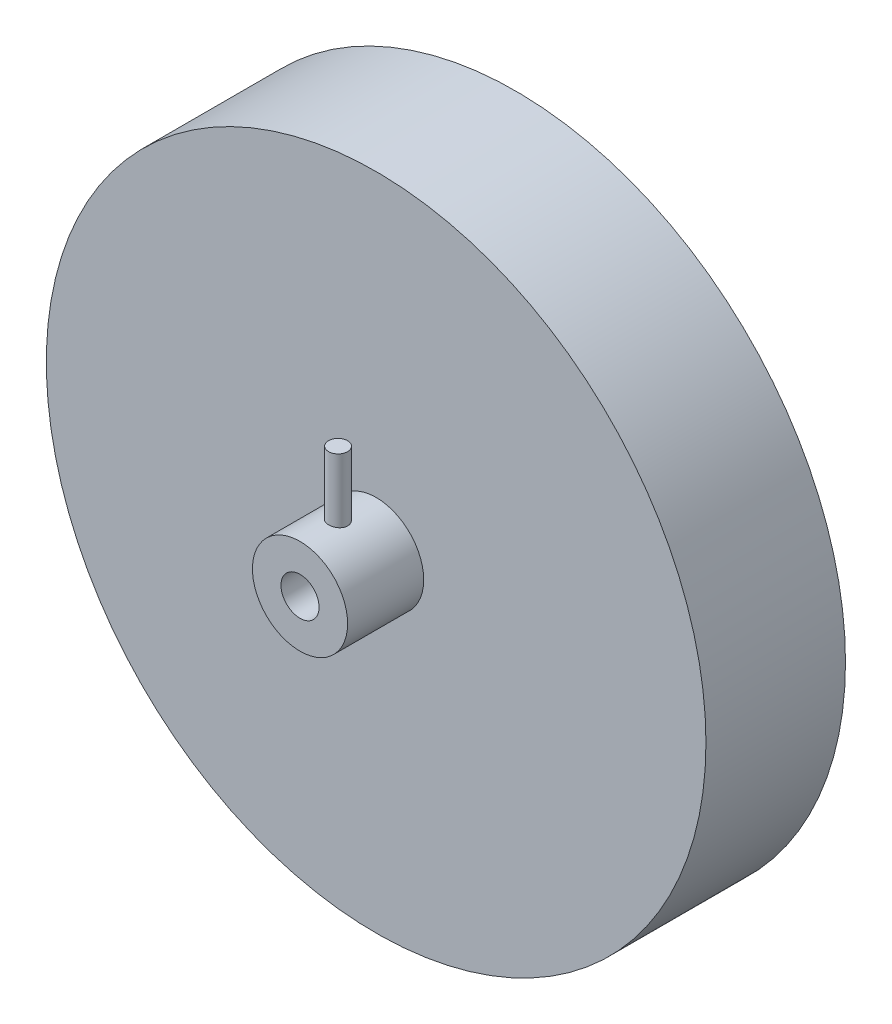
ISO-10303-21;
HEADER;
FILE_DESCRIPTION(('STEP AP214'),'2;1');
FILE_NAME('part.step','',(''),(''),'','','');
FILE_SCHEMA(('AUTOMOTIVE_DESIGN { 1 0 10303 214 1 1 1 1 }'));
ENDSEC;
DATA;
#1=APPLICATION_CONTEXT('core data for automotive mechanical design processes');
#2=APPLICATION_PROTOCOL_DEFINITION('international standard','automotive_design',2000,#1);
#3=PRODUCT_CONTEXT('',#1,'mechanical');
#4=PRODUCT('Part','Part','',(#3));
#5=PRODUCT_RELATED_PRODUCT_CATEGORY('part','',(#4));
#6=PRODUCT_DEFINITION_FORMATION('','',#4);
#7=PRODUCT_DEFINITION_CONTEXT('part definition',#1,'design');
#8=PRODUCT_DEFINITION('design','',#6,#7);
#9=PRODUCT_DEFINITION_SHAPE('','',#8);
#10=(LENGTH_UNIT() NAMED_UNIT(*) SI_UNIT(.MILLI.,.METRE.));
#11=(NAMED_UNIT(*) PLANE_ANGLE_UNIT() SI_UNIT($,.RADIAN.));
#12=(NAMED_UNIT(*) SI_UNIT($,.STERADIAN.) SOLID_ANGLE_UNIT());
#13=UNCERTAINTY_MEASURE_WITH_UNIT(LENGTH_MEASURE(1.E-05),#10,'distance_accuracy_value','');
#14=(GEOMETRIC_REPRESENTATION_CONTEXT(3) GLOBAL_UNCERTAINTY_ASSIGNED_CONTEXT((#13)) GLOBAL_UNIT_ASSIGNED_CONTEXT((#10,
#11,#12)) REPRESENTATION_CONTEXT('',''));
#15=CARTESIAN_POINT('',(0.,0.,0.));
#16=DIRECTION('',(0.,0.,1.));
#17=DIRECTION('',(1.,0.,0.));
#18=AXIS2_PLACEMENT_3D('',#15,#16,#17);
#19=CARTESIAN_POINT('',(0.,0.,23.));
#20=DIRECTION('',(0.,0.,-1.));
#21=DIRECTION('',(-1.,0.,0.));
#22=AXIS2_PLACEMENT_3D('',#19,#20,#21);
#23=CYLINDRICAL_SURFACE('',#22,7.5);
#24=CARTESIAN_POINT('',(0.,0.,23.));
#25=DIRECTION('',(0.,0.,1.));
#26=DIRECTION('',(1.,0.,0.));
#27=AXIS2_PLACEMENT_3D('',#24,#25,#26);
#28=CIRCLE('',#27,7.5);
#29=CARTESIAN_POINT('',(7.5,0.,23.));
#30=VERTEX_POINT('',#29);
#31=EDGE_CURVE('E51',#30,#30,#28,.T.);
#32=ORIENTED_EDGE('',*,*,#31,.F.);
#33=EDGE_LOOP('',(#32));
#34=FACE_BOUND('',#33,.T.);
#35=CARTESIAN_POINT('',(0.,0.,11.));
#36=DIRECTION('',(0.,0.,1.));
#37=DIRECTION('',(1.,0.,0.));
#38=AXIS2_PLACEMENT_3D('',#35,#36,#37);
#39=CIRCLE('',#38,7.5);
#40=CARTESIAN_POINT('',(7.5,0.,11.));
#41=VERTEX_POINT('',#40);
#42=EDGE_CURVE('E53',#41,#41,#39,.T.);
#43=ORIENTED_EDGE('',*,*,#42,.T.);
#44=EDGE_LOOP('',(#43));
#45=FACE_BOUND('',#44,.T.);
#46=CARTESIAN_POINT('',(0.,7.5,15.5));
#47=CARTESIAN_POINT('',(-0.0833653601889465,7.49999846371307,15.5000030667475));
#48=CARTESIAN_POINT('',(-0.16676949030228,7.49859577767346,15.5069732644515));
#49=CARTESIAN_POINT('',(-0.331220261533526,7.49313548434847,15.5346477501729));
#50=CARTESIAN_POINT('',(-0.412264976312031,7.48907576790279,15.5553629492023));
#51=CARTESIAN_POINT('',(-0.569595457894967,7.4787547391743,15.6098619104312));
#52=CARTESIAN_POINT('',(-0.645885701899699,7.47249553615077,15.643633155267));
#53=CARTESIAN_POINT('',(-0.791711983296336,7.45845597052971,15.7232483712669));
#54=CARTESIAN_POINT('',(-0.861248422613715,7.4506756985356,15.7690916234108));
#55=CARTESIAN_POINT('',(-0.992540215972295,7.43433247994955,15.8722077414372));
#56=CARTESIAN_POINT('',(-1.05419092673778,7.42576118256521,15.9296125330868));
#57=CARTESIAN_POINT('',(-1.16705513491204,7.40886270678882,16.0539386245876));
#58=CARTESIAN_POINT('',(-1.21826781715564,7.40053554750636,16.1208606670027));
#59=CARTESIAN_POINT('',(-1.30924763002143,7.38498662718923,16.2630742895178));
#60=CARTESIAN_POINT('',(-1.3489064082988,7.37777561047419,16.3384364656945));
#61=CARTESIAN_POINT('',(-1.41495849987046,7.36539402087627,16.4949227285061));
#62=CARTESIAN_POINT('',(-1.44135312365585,7.36022324642943,16.5760462450195));
#63=CARTESIAN_POINT('',(-1.47978794982724,7.35259207878307,16.7406265458619));
#64=CARTESIAN_POINT('',(-1.49201174693816,7.35009705160781,16.8240388162133));
#65=CARTESIAN_POINT('',(-1.50232819158918,7.34799562590941,16.9917647320465));
#66=CARTESIAN_POINT('',(-1.50042228407025,7.34838893201761,17.0760782844802));
#67=CARTESIAN_POINT('',(-1.48268185965273,7.35198826722277,17.2418701820315));
#68=CARTESIAN_POINT('',(-1.46705781036586,7.35515179288145,17.323372108441));
#69=CARTESIAN_POINT('',(-1.42265682693457,7.36386819240002,17.4825741149945));
#70=CARTESIAN_POINT('',(-1.39387926465102,7.36942118036668,17.5602740133785));
#71=CARTESIAN_POINT('',(-1.32378717551208,7.38233427750612,17.7102728925554));
#72=CARTESIAN_POINT('',(-1.28238922684817,7.38970634720557,17.7825318193538));
#73=CARTESIAN_POINT('',(-1.18829036185902,7.40541928159593,17.9191562749592));
#74=CARTESIAN_POINT('',(-1.13558814653524,7.41376025757549,17.9835208952767));
#75=CARTESIAN_POINT('',(-1.01924990184087,7.43065531862193,18.1037441036854));
#76=CARTESIAN_POINT('',(-0.955434241818663,7.43921053816357,18.1594288517887));
#77=CARTESIAN_POINT('',(-0.81927753609301,7.45543273071613,18.2593307694518));
#78=CARTESIAN_POINT('',(-0.746936381069079,7.4630996923346,18.3035477919404));
#79=CARTESIAN_POINT('',(-0.595589080318377,7.47670035241331,18.379291263839));
#80=CARTESIAN_POINT('',(-0.516572729377946,7.48263133272408,18.4107978404668));
#81=CARTESIAN_POINT('',(-0.354223464672992,7.49207113481787,18.4600407110579));
#82=CARTESIAN_POINT('',(-0.270891075108669,7.49558025000797,18.4777786731104));
#83=CARTESIAN_POINT('',(-0.10376910844072,7.49974007800302,18.4987346806914));
#84=CARTESIAN_POINT('',(-0.0200104924883584,7.50043761978705,18.5021906293104));
#85=CARTESIAN_POINT('',(0.146887401289077,7.49902577895154,18.4951252115867));
#86=CARTESIAN_POINT('',(0.230026713665695,7.49691655412169,18.4846046309711));
#87=CARTESIAN_POINT('',(0.392558489919816,7.49015748012026,18.4500824396841));
#88=CARTESIAN_POINT('',(0.471977922509859,7.4855306460631,18.4262028972531));
#89=CARTESIAN_POINT('',(0.625685441249506,7.47425328091549,18.3657740260163));
#90=CARTESIAN_POINT('',(0.699973142456314,7.4676025982134,18.3292237479848));
#91=CARTESIAN_POINT('',(0.842311760529332,7.45289867299941,18.243976264023));
#92=CARTESIAN_POINT('',(0.910275190128288,7.44482925655578,18.1951358284416));
#93=CARTESIAN_POINT('',(1.03712702867882,7.42822102244823,18.0868862131891));
#94=CARTESIAN_POINT('',(1.09601446339615,7.41968215452582,18.0274759004002));
#95=CARTESIAN_POINT('',(1.20396088616127,7.40293955335447,17.8986899721633));
#96=CARTESIAN_POINT('',(1.25285655367299,7.39474290349956,17.829176383668));
#97=CARTESIAN_POINT('',(1.33827813007681,7.37976287694291,17.682782957965));
#98=CARTESIAN_POINT('',(1.37480453388436,7.37297944370014,17.6059034156397));
#99=CARTESIAN_POINT('',(1.43422776237295,7.36165110876574,17.4473476307757));
#100=CARTESIAN_POINT('',(1.45719524968658,7.3570946230828,17.3656987381845));
#101=CARTESIAN_POINT('',(1.4890629774408,7.35071155188038,17.1995998197636));
#102=CARTESIAN_POINT('',(1.49796505233767,7.34888461036667,17.115150160686));
#103=CARTESIAN_POINT('',(1.50138136630121,7.34818724447069,16.9474867031835));
#104=CARTESIAN_POINT('',(1.49615368210635,7.34926378783951,16.8642782766095));
#105=CARTESIAN_POINT('',(1.4720284561501,7.35413360226921,16.6999525251425));
#106=CARTESIAN_POINT('',(1.45313102419395,7.35792685150754,16.6188351834578));
#107=CARTESIAN_POINT('',(1.40231785274844,7.36777896328738,16.4611584331392));
#108=CARTESIAN_POINT('',(1.37043376007602,7.37383231528246,16.3845884592464));
#109=CARTESIAN_POINT('',(1.29458196690241,7.38752572461255,16.2378444188983));
#110=CARTESIAN_POINT('',(1.25061325316233,7.39516591498341,16.1676708894123));
#111=CARTESIAN_POINT('',(1.15095887217963,7.41133440784838,16.0344266417745));
#112=CARTESIAN_POINT('',(1.09508683085277,7.41987559364549,15.9714968520986));
#113=CARTESIAN_POINT('',(0.973596553519713,7.43679122807932,15.8558206917062));
#114=CARTESIAN_POINT('',(0.907976080730003,7.44516563794777,15.8030766645241));
#115=CARTESIAN_POINT('',(0.76802644363237,7.46090748581957,15.7087480340803));
#116=CARTESIAN_POINT('',(0.693613326644753,7.46826346828869,15.66728599508));
#117=CARTESIAN_POINT('',(0.5387495414111,7.481026876275,15.5975208161051));
#118=CARTESIAN_POINT('',(0.458304391294691,7.48643605707924,15.5692058157013));
#119=CARTESIAN_POINT('',(0.314732233385671,7.49364558893056,15.5320220779329));
#120=CARTESIAN_POINT('',(0.252422496020678,7.49601454737677,15.5200352094384));
#121=CARTESIAN_POINT('',(0.126749287815103,7.49919231209839,15.5040231314625));
#122=CARTESIAN_POINT('',(0.0633858506229314,7.50000116809732,15.4999976682353));
#123=CARTESIAN_POINT('',(0.,7.5,15.5));
#124=B_SPLINE_CURVE_WITH_KNOTS('',3,(#46,#47,#48,#49,#50,#51,#52,#53,#54,#55,#56,#57,#58,#59,
#60,#61,#62,#63,#64,#65,#66,#67,#68,#69,#70,#71,#72,#73,#74,#75,#76,#77,#78,#79,#80,#81,#82,#83,
#84,#85,#86,#87,#88,#89,#90,#91,#92,#93,#94,#95,#96,#97,#98,#99,#100,#101,#102,#103,#104,#105,
#106,#107,#108,#109,#110,#111,#112,#113,#114,#115,#116,#117,#118,#119,#120,#121,#122,#123),
.UNSPECIFIED.,.T.,.F.,(4,2,2,2,2,2,2,2,2,2,2,2,2,2,2,2,2,2,2,2,2,2,2,2,2,2,2,2,2,2,2,2,2,2,2,2,
2,2,4),(0.,0.249864195991888,0.499926976036986,0.749750602875513,0.999559353346296,
1.25239900516828,1.50525839512105,1.76041792508884,2.01555224047797,2.26734277655381,
2.51910756421838,2.76707590509418,3.01505608880595,3.26471235305389,3.51439732124506,
3.76857378737026,4.02275351309731,4.27732912281036,4.53187388547055,4.78216103514398,
5.03243411486802,5.28045680926086,5.52849808824034,5.77957599050039,6.03068082518896,
6.2856094286884,6.54052783085201,6.79410571549085,7.04765052495623,7.29659583851553,
7.54553915238913,7.79387941879666,8.042240513728,8.29482114358715,8.54745981799397,
8.80274245013456,9.05779433276279,9.24778162934842,9.43776287056495),.UNSPECIFIED.);
#125=CARTESIAN_POINT('',(0.,7.5,15.5));
#126=VERTEX_POINT('',#125);
#127=EDGE_CURVE('E10',#126,#126,#124,.T.);
#128=ORIENTED_EDGE('',*,*,#127,.F.);
#129=EDGE_LOOP('',(#128));
#130=FACE_BOUND('',#129,.T.);
#131=ADVANCED_FACE('F30',(#34,#45,#130),#23,.T.);
#132=CARTESIAN_POINT('',(0.,0.,11.));
#133=DIRECTION('',(0.,0.,-1.));
#134=DIRECTION('',(-1.,0.,0.));
#135=AXIS2_PLACEMENT_3D('',#132,#133,#134);
#136=CYLINDRICAL_SURFACE('',#135,52.);
#137=CARTESIAN_POINT('',(0.,0.,11.));
#138=DIRECTION('',(0.,0.,1.));
#139=DIRECTION('',(1.,0.,0.));
#140=AXIS2_PLACEMENT_3D('',#137,#138,#139);
#141=CIRCLE('',#140,52.);
#142=CARTESIAN_POINT('',(52.,0.,11.));
#143=VERTEX_POINT('',#142);
#144=EDGE_CURVE('E42',#143,#143,#141,.T.);
#145=ORIENTED_EDGE('',*,*,#144,.F.);
#146=EDGE_LOOP('',(#145));
#147=FACE_BOUND('',#146,.T.);
#148=CARTESIAN_POINT('',(0.,0.,-11.));
#149=DIRECTION('',(0.,0.,1.));
#150=DIRECTION('',(1.,0.,0.));
#151=AXIS2_PLACEMENT_3D('',#148,#149,#150);
#152=CIRCLE('',#151,52.);
#153=CARTESIAN_POINT('',(52.,0.,-11.));
#154=VERTEX_POINT('',#153);
#155=EDGE_CURVE('E46',#154,#154,#152,.T.);
#156=ORIENTED_EDGE('',*,*,#155,.T.);
#157=EDGE_LOOP('',(#156));
#158=FACE_BOUND('',#157,.T.);
#159=ADVANCED_FACE('F32',(#147,#158),#136,.T.);
#160=CARTESIAN_POINT('',(0.,0.,11.));
#161=DIRECTION('',(0.,0.,1.));
#162=DIRECTION('',(1.,0.,0.));
#163=AXIS2_PLACEMENT_3D('',#160,#161,#162);
#164=PLANE('',#163);
#165=ORIENTED_EDGE('',*,*,#42,.F.);
#166=EDGE_LOOP('',(#165));
#167=FACE_BOUND('',#166,.T.);
#168=ORIENTED_EDGE('',*,*,#144,.T.);
#169=EDGE_LOOP('',(#168));
#170=FACE_BOUND('',#169,.T.);
#171=ADVANCED_FACE('F84',(#167,#170),#164,.T.);
#172=CARTESIAN_POINT('',(0.,0.,-11.));
#173=DIRECTION('',(0.,0.,1.));
#174=DIRECTION('',(1.,0.,0.));
#175=AXIS2_PLACEMENT_3D('',#172,#173,#174);
#176=PLANE('',#175);
#177=ORIENTED_EDGE('',*,*,#155,.F.);
#178=EDGE_LOOP('',(#177));
#179=FACE_BOUND('',#178,.T.);
#180=ADVANCED_FACE('F93',(#179),#176,.F.);
#181=CARTESIAN_POINT('',(0.,0.,23.));
#182=DIRECTION('',(0.,0.,1.));
#183=DIRECTION('',(1.,0.,0.));
#184=AXIS2_PLACEMENT_3D('',#181,#182,#183);
#185=PLANE('',#184);
#186=CARTESIAN_POINT('',(0.,0.,23.));
#187=DIRECTION('',(0.,0.,-1.));
#188=DIRECTION('',(-1.,0.,0.));
#189=AXIS2_PLACEMENT_3D('',#186,#187,#188);
#190=CIRCLE('',#189,3.);
#191=CARTESIAN_POINT('',(-3.,0.,23.));
#192=VERTEX_POINT('',#191);
#193=EDGE_CURVE('E62',#192,#192,#190,.T.);
#194=ORIENTED_EDGE('',*,*,#193,.T.);
#195=EDGE_LOOP('',(#194));
#196=FACE_BOUND('',#195,.T.);
#197=ORIENTED_EDGE('',*,*,#31,.T.);
#198=EDGE_LOOP('',(#197));
#199=FACE_BOUND('',#198,.T.);
#200=ADVANCED_FACE('F91',(#196,#199),#185,.T.);
#201=CARTESIAN_POINT('',(0.,17.5,17.));
#202=DIRECTION('',(0.,-1.,0.));
#203=DIRECTION('',(0.,0.,-1.));
#204=AXIS2_PLACEMENT_3D('',#201,#202,#203);
#205=CYLINDRICAL_SURFACE('',#204,1.5);
#206=CARTESIAN_POINT('',(0.,17.5,17.));
#207=DIRECTION('',(0.,1.,0.));
#208=DIRECTION('',(0.,0.,1.));
#209=AXIS2_PLACEMENT_3D('',#206,#207,#208);
#210=CIRCLE('',#209,1.5);
#211=CARTESIAN_POINT('',(0.,17.5,18.5));
#212=VERTEX_POINT('',#211);
#213=EDGE_CURVE('E56',#212,#212,#210,.T.);
#214=ORIENTED_EDGE('',*,*,#213,.F.);
#215=EDGE_LOOP('',(#214));
#216=FACE_BOUND('',#215,.T.);
#217=ORIENTED_EDGE('',*,*,#127,.T.);
#218=EDGE_LOOP('',(#217));
#219=FACE_BOUND('',#218,.T.);
#220=ADVANCED_FACE('F100',(#216,#219),#205,.T.);
#221=CARTESIAN_POINT('',(0.,17.5,17.));
#222=DIRECTION('',(0.,1.,0.));
#223=DIRECTION('',(0.,0.,1.));
#224=AXIS2_PLACEMENT_3D('',#221,#222,#223);
#225=PLANE('',#224);
#226=ORIENTED_EDGE('',*,*,#213,.T.);
#227=EDGE_LOOP('',(#226));
#228=FACE_BOUND('',#227,.T.);
#229=ADVANCED_FACE('F77',(#228),#225,.T.);
#230=CARTESIAN_POINT('',(0.,0.,11.));
#231=DIRECTION('',(0.,0.,1.));
#232=DIRECTION('',(1.,0.,0.));
#233=AXIS2_PLACEMENT_3D('',#230,#231,#232);
#234=CYLINDRICAL_SURFACE('',#233,3.);
#235=CARTESIAN_POINT('',(0.,0.,11.));
#236=DIRECTION('',(0.,0.,-1.));
#237=DIRECTION('',(-1.,0.,0.));
#238=AXIS2_PLACEMENT_3D('',#235,#236,#237);
#239=CIRCLE('',#238,3.);
#240=CARTESIAN_POINT('',(-3.,0.,11.));
#241=VERTEX_POINT('',#240);
#242=EDGE_CURVE('E61',#241,#241,#239,.T.);
#243=ORIENTED_EDGE('',*,*,#242,.T.);
#244=EDGE_LOOP('',(#243));
#245=FACE_BOUND('',#244,.T.);
#246=ORIENTED_EDGE('',*,*,#193,.F.);
#247=EDGE_LOOP('',(#246));
#248=FACE_BOUND('',#247,.T.);
#249=ADVANCED_FACE('F68',(#245,#248),#234,.F.);
#250=CARTESIAN_POINT('',(0.,0.,11.));
#251=DIRECTION('',(0.,0.,-1.));
#252=DIRECTION('',(-1.,0.,0.));
#253=AXIS2_PLACEMENT_3D('',#250,#251,#252);
#254=PLANE('',#253);
#255=ORIENTED_EDGE('',*,*,#242,.F.);
#256=EDGE_LOOP('',(#255));
#257=FACE_BOUND('',#256,.T.);
#258=ADVANCED_FACE('F71',(#257),#254,.F.);
#259=CLOSED_SHELL('',(#131,#159,#171,#180,#200,#220,#229,#249,#258));
#260=MANIFOLD_SOLID_BREP('B2',#259);
#261=ADVANCED_BREP_SHAPE_REPRESENTATION('',(#18,#260),#14);
#262=SHAPE_DEFINITION_REPRESENTATION(#9,#261);
ENDSEC;
END-ISO-10303-21;
